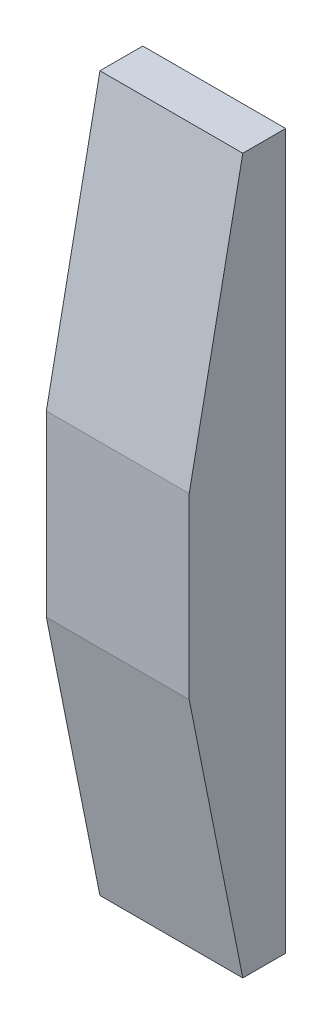
ISO-10303-21;
HEADER;
FILE_DESCRIPTION(('STEP AP214'),'2;1');
FILE_NAME('part.step','',(''),(''),'','','');
FILE_SCHEMA(('AUTOMOTIVE_DESIGN { 1 0 10303 214 1 1 1 1 }'));
ENDSEC;
DATA;
#1=APPLICATION_CONTEXT('core data for automotive mechanical design processes');
#2=APPLICATION_PROTOCOL_DEFINITION('international standard','automotive_design',2000,#1);
#3=PRODUCT_CONTEXT('',#1,'mechanical');
#4=PRODUCT('Part','Part','',(#3));
#5=PRODUCT_RELATED_PRODUCT_CATEGORY('part','',(#4));
#6=PRODUCT_DEFINITION_FORMATION('','',#4);
#7=PRODUCT_DEFINITION_CONTEXT('part definition',#1,'design');
#8=PRODUCT_DEFINITION('design','',#6,#7);
#9=PRODUCT_DEFINITION_SHAPE('','',#8);
#10=(LENGTH_UNIT() NAMED_UNIT(*) SI_UNIT(.MILLI.,.METRE.));
#11=(NAMED_UNIT(*) PLANE_ANGLE_UNIT() SI_UNIT($,.RADIAN.));
#12=(NAMED_UNIT(*) SI_UNIT($,.STERADIAN.) SOLID_ANGLE_UNIT());
#13=UNCERTAINTY_MEASURE_WITH_UNIT(LENGTH_MEASURE(1.E-05),#10,'distance_accuracy_value','');
#14=(GEOMETRIC_REPRESENTATION_CONTEXT(3) GLOBAL_UNCERTAINTY_ASSIGNED_CONTEXT((#13)) GLOBAL_UNIT_ASSIGNED_CONTEXT((#10,
#11,#12)) REPRESENTATION_CONTEXT('',''));
#15=CARTESIAN_POINT('',(0.,0.,0.));
#16=DIRECTION('',(0.,0.,1.));
#17=DIRECTION('',(1.,0.,0.));
#18=AXIS2_PLACEMENT_3D('',#15,#16,#17);
#19=CARTESIAN_POINT('',(-1020.,500.,1.35935794705356E-13));
#20=DIRECTION('',(0.,0.196116135138184,0.98058067569092));
#21=DIRECTION('',(0.,-0.98058067569092,0.196116135138184));
#22=AXIS2_PLACEMENT_3D('',#19,#20,#21);
#23=PLANE('',#22);
#24=DIRECTION('',(0.,0.98058067569092,-0.196116135138184));
#25=VECTOR('',#24,1.);
#26=CARTESIAN_POINT('',(-1220.,500.,1.35935794705356E-13));
#27=LINE('',#26,#25);
#28=CARTESIAN_POINT('',(-1220.,125.,75.0000000000001));
#29=VERTEX_POINT('',#28);
#30=CARTESIAN_POINT('',(-1220.,500.,1.35935794705356E-13));
#31=VERTEX_POINT('',#30);
#32=EDGE_CURVE('E132',#29,#31,#27,.T.);
#33=ORIENTED_EDGE('',*,*,#32,.F.);
#34=DIRECTION('',(-1.,0.,0.));
#35=VECTOR('',#34,1.);
#36=CARTESIAN_POINT('',(-1020.,125.,75.0000000000001));
#37=LINE('',#36,#35);
#38=CARTESIAN_POINT('',(-1020.,125.,75.0000000000001));
#39=VERTEX_POINT('',#38);
#40=EDGE_CURVE('E49',#39,#29,#37,.T.);
#41=ORIENTED_EDGE('',*,*,#40,.F.);
#42=DIRECTION('',(0.,0.98058067569092,-0.196116135138184));
#43=VECTOR('',#42,1.);
#44=CARTESIAN_POINT('',(-1020.,500.,1.35935794705356E-13));
#45=LINE('',#44,#43);
#46=CARTESIAN_POINT('',(-1020.,500.,1.35935794705356E-13));
#47=VERTEX_POINT('',#46);
#48=EDGE_CURVE('E57',#39,#47,#45,.T.);
#49=ORIENTED_EDGE('',*,*,#48,.T.);
#50=DIRECTION('',(-1.,0.,0.));
#51=VECTOR('',#50,1.);
#52=CARTESIAN_POINT('',(-1020.,500.,1.35935794705356E-13));
#53=LINE('',#52,#51);
#54=EDGE_CURVE('E11',#47,#31,#53,.T.);
#55=ORIENTED_EDGE('',*,*,#54,.T.);
#56=EDGE_LOOP('',(#33,#41,#49,#55));
#57=FACE_BOUND('',#56,.T.);
#58=ADVANCED_FACE('F39',(#57),#23,.T.);
#59=CARTESIAN_POINT('',(-1020.,125.,75.0000000000001));
#60=DIRECTION('',(0.,0.,1.));
#61=DIRECTION('',(1.,0.,0.));
#62=AXIS2_PLACEMENT_3D('',#59,#60,#61);
#63=PLANE('',#62);
#64=DIRECTION('',(0.,1.,0.));
#65=VECTOR('',#64,1.);
#66=CARTESIAN_POINT('',(-1220.,125.,75.0000000000001));
#67=LINE('',#66,#65);
#68=CARTESIAN_POINT('',(-1220.,-125.,75.0000000000001));
#69=VERTEX_POINT('',#68);
#70=EDGE_CURVE('E123',#69,#29,#67,.T.);
#71=ORIENTED_EDGE('',*,*,#70,.F.);
#72=DIRECTION('',(-1.,0.,0.));
#73=VECTOR('',#72,1.);
#74=CARTESIAN_POINT('',(-1020.,-125.,75.0000000000001));
#75=LINE('',#74,#73);
#76=CARTESIAN_POINT('',(-1020.,-125.,75.0000000000001));
#77=VERTEX_POINT('',#76);
#78=EDGE_CURVE('E137',#77,#69,#75,.T.);
#79=ORIENTED_EDGE('',*,*,#78,.F.);
#80=DIRECTION('',(0.,1.,0.));
#81=VECTOR('',#80,1.);
#82=CARTESIAN_POINT('',(-1020.,125.,75.0000000000001));
#83=LINE('',#82,#81);
#84=EDGE_CURVE('E131',#77,#39,#83,.T.);
#85=ORIENTED_EDGE('',*,*,#84,.T.);
#86=ORIENTED_EDGE('',*,*,#40,.T.);
#87=EDGE_LOOP('',(#71,#79,#85,#86));
#88=FACE_BOUND('',#87,.T.);
#89=ADVANCED_FACE('F139',(#88),#63,.T.);
#90=CARTESIAN_POINT('',(-1020.,-125.,75.0000000000001));
#91=DIRECTION('',(0.,-0.196116135138184,0.98058067569092));
#92=DIRECTION('',(0.,-0.98058067569092,-0.196116135138184));
#93=AXIS2_PLACEMENT_3D('',#90,#91,#92);
#94=PLANE('',#93);
#95=DIRECTION('',(0.,0.98058067569092,0.196116135138184));
#96=VECTOR('',#95,1.);
#97=CARTESIAN_POINT('',(-1220.,-125.,75.0000000000001));
#98=LINE('',#97,#96);
#99=CARTESIAN_POINT('',(-1220.,-500.,0.));
#100=VERTEX_POINT('',#99);
#101=EDGE_CURVE('E121',#100,#69,#98,.T.);
#102=ORIENTED_EDGE('',*,*,#101,.F.);
#103=DIRECTION('',(-1.,0.,0.));
#104=VECTOR('',#103,1.);
#105=CARTESIAN_POINT('',(-1020.,-500.,1.35935794705356E-13));
#106=LINE('',#105,#104);
#107=CARTESIAN_POINT('',(-1020.,-500.,1.35935794705356E-13));
#108=VERTEX_POINT('',#107);
#109=EDGE_CURVE('E43',#108,#100,#106,.T.);
#110=ORIENTED_EDGE('',*,*,#109,.F.);
#111=DIRECTION('',(0.,0.98058067569092,0.196116135138184));
#112=VECTOR('',#111,1.);
#113=CARTESIAN_POINT('',(-1020.,-125.,75.0000000000001));
#114=LINE('',#113,#112);
#115=EDGE_CURVE('E129',#108,#77,#114,.T.);
#116=ORIENTED_EDGE('',*,*,#115,.T.);
#117=ORIENTED_EDGE('',*,*,#78,.T.);
#118=EDGE_LOOP('',(#102,#110,#116,#117));
#119=FACE_BOUND('',#118,.T.);
#120=ADVANCED_FACE('F41',(#119),#94,.T.);
#121=CARTESIAN_POINT('',(-1020.,0.,0.));
#122=DIRECTION('',(1.,0.,0.));
#123=DIRECTION('',(0.,0.,-1.));
#124=AXIS2_PLACEMENT_3D('',#121,#122,#123);
#125=PLANE('',#124);
#126=ORIENTED_EDGE('',*,*,#115,.F.);
#127=DIRECTION('',(0.,0.,1.));
#128=VECTOR('',#127,1.);
#129=CARTESIAN_POINT('',(-1020.,-500.,-60.));
#130=LINE('',#129,#128);
#131=CARTESIAN_POINT('',(-1020.,-500.,-60.));
#132=VERTEX_POINT('',#131);
#133=EDGE_CURVE('E145',#132,#108,#130,.T.);
#134=ORIENTED_EDGE('',*,*,#133,.F.);
#135=DIRECTION('',(0.,-1.,0.));
#136=VECTOR('',#135,1.);
#137=CARTESIAN_POINT('',(-1020.,500.,-60.));
#138=LINE('',#137,#136);
#139=CARTESIAN_POINT('',(-1020.,500.,-60.));
#140=VERTEX_POINT('',#139);
#141=EDGE_CURVE('E115',#140,#132,#138,.T.);
#142=ORIENTED_EDGE('',*,*,#141,.F.);
#143=DIRECTION('',(0.,0.,1.));
#144=VECTOR('',#143,1.);
#145=CARTESIAN_POINT('',(-1020.,500.,-60.));
#146=LINE('',#145,#144);
#147=EDGE_CURVE('E125',#140,#47,#146,.T.);
#148=ORIENTED_EDGE('',*,*,#147,.T.);
#149=ORIENTED_EDGE('',*,*,#48,.F.);
#150=ORIENTED_EDGE('',*,*,#84,.F.);
#151=EDGE_LOOP('',(#126,#134,#142,#148,#149,#150));
#152=FACE_BOUND('',#151,.T.);
#153=ADVANCED_FACE('F142',(#152),#125,.T.);
#154=CARTESIAN_POINT('',(-1220.,0.,0.));
#155=DIRECTION('',(1.,0.,0.));
#156=DIRECTION('',(0.,0.,-1.));
#157=AXIS2_PLACEMENT_3D('',#154,#155,#156);
#158=PLANE('',#157);
#159=ORIENTED_EDGE('',*,*,#32,.T.);
#160=DIRECTION('',(0.,0.,1.));
#161=VECTOR('',#160,1.);
#162=CARTESIAN_POINT('',(-1220.,500.,-60.));
#163=LINE('',#162,#161);
#164=CARTESIAN_POINT('',(-1220.,500.,-60.));
#165=VERTEX_POINT('',#164);
#166=EDGE_CURVE('E106',#165,#31,#163,.T.);
#167=ORIENTED_EDGE('',*,*,#166,.F.);
#168=DIRECTION('',(0.,1.,0.));
#169=VECTOR('',#168,1.);
#170=CARTESIAN_POINT('',(-1220.,-500.,-60.));
#171=LINE('',#170,#169);
#172=CARTESIAN_POINT('',(-1220.,-500.,-60.));
#173=VERTEX_POINT('',#172);
#174=EDGE_CURVE('E99',#173,#165,#171,.T.);
#175=ORIENTED_EDGE('',*,*,#174,.F.);
#176=DIRECTION('',(0.,0.,1.));
#177=VECTOR('',#176,1.);
#178=CARTESIAN_POINT('',(-1220.,-500.,-60.));
#179=LINE('',#178,#177);
#180=EDGE_CURVE('E104',#173,#100,#179,.T.);
#181=ORIENTED_EDGE('',*,*,#180,.T.);
#182=ORIENTED_EDGE('',*,*,#101,.T.);
#183=ORIENTED_EDGE('',*,*,#70,.T.);
#184=EDGE_LOOP('',(#159,#167,#175,#181,#182,#183));
#185=FACE_BOUND('',#184,.T.);
#186=ADVANCED_FACE('F101',(#185),#158,.F.);
#187=CARTESIAN_POINT('',(-1020.,-500.,-60.));
#188=DIRECTION('',(0.,1.,0.));
#189=DIRECTION('',(0.,0.,1.));
#190=AXIS2_PLACEMENT_3D('',#187,#188,#189);
#191=PLANE('',#190);
#192=ORIENTED_EDGE('',*,*,#109,.T.);
#193=ORIENTED_EDGE('',*,*,#180,.F.);
#194=DIRECTION('',(-1.,0.,0.));
#195=VECTOR('',#194,1.);
#196=CARTESIAN_POINT('',(-1020.,-500.,-60.));
#197=LINE('',#196,#195);
#198=EDGE_CURVE('E110',#132,#173,#197,.T.);
#199=ORIENTED_EDGE('',*,*,#198,.F.);
#200=ORIENTED_EDGE('',*,*,#133,.T.);
#201=EDGE_LOOP('',(#192,#193,#199,#200));
#202=FACE_BOUND('',#201,.T.);
#203=ADVANCED_FACE('F120',(#202),#191,.F.);
#204=CARTESIAN_POINT('',(-1220.,500.,-60.));
#205=DIRECTION('',(0.,-1.,0.));
#206=DIRECTION('',(0.,0.,-1.));
#207=AXIS2_PLACEMENT_3D('',#204,#205,#206);
#208=PLANE('',#207);
#209=ORIENTED_EDGE('',*,*,#54,.F.);
#210=ORIENTED_EDGE('',*,*,#147,.F.);
#211=DIRECTION('',(1.,0.,0.));
#212=VECTOR('',#211,1.);
#213=CARTESIAN_POINT('',(-1220.,500.,-60.));
#214=LINE('',#213,#212);
#215=EDGE_CURVE('E109',#165,#140,#214,.T.);
#216=ORIENTED_EDGE('',*,*,#215,.F.);
#217=ORIENTED_EDGE('',*,*,#166,.T.);
#218=EDGE_LOOP('',(#209,#210,#216,#217));
#219=FACE_BOUND('',#218,.T.);
#220=ADVANCED_FACE('F149',(#219),#208,.F.);
#221=CARTESIAN_POINT('',(0.,0.,-60.));
#222=DIRECTION('',(0.,0.,-1.));
#223=DIRECTION('',(-1.,0.,0.));
#224=AXIS2_PLACEMENT_3D('',#221,#222,#223);
#225=PLANE('',#224);
#226=ORIENTED_EDGE('',*,*,#198,.T.);
#227=ORIENTED_EDGE('',*,*,#174,.T.);
#228=ORIENTED_EDGE('',*,*,#215,.T.);
#229=ORIENTED_EDGE('',*,*,#141,.T.);
#230=EDGE_LOOP('',(#226,#227,#228,#229));
#231=FACE_BOUND('',#230,.T.);
#232=ADVANCED_FACE('F113',(#231),#225,.T.);
#233=CLOSED_SHELL('',(#58,#89,#120,#153,#186,#203,#220,#232));
#234=MANIFOLD_SOLID_BREP('B2',#233);
#235=ADVANCED_BREP_SHAPE_REPRESENTATION('',(#18,#234),#14);
#236=SHAPE_DEFINITION_REPRESENTATION(#9,#235);
ENDSEC;
END-ISO-10303-21;
